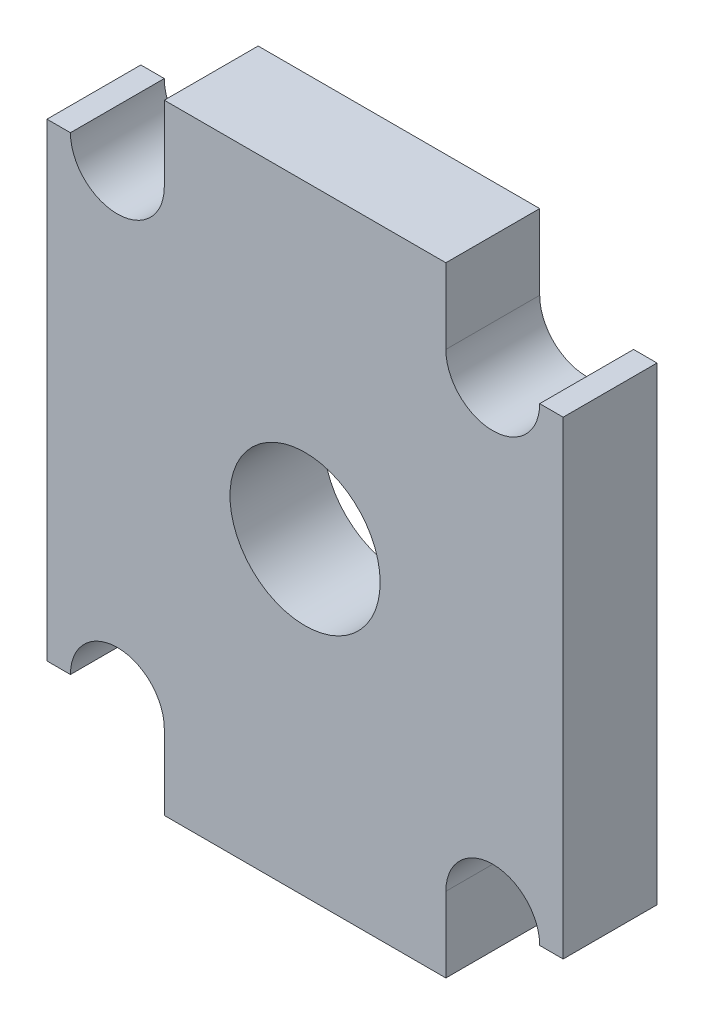
ISO-10303-21;
HEADER;
FILE_DESCRIPTION(('STEP AP214'),'2;1');
FILE_NAME('part.step','',(''),(''),'','','');
FILE_SCHEMA(('AUTOMOTIVE_DESIGN { 1 0 10303 214 1 1 1 1 }'));
ENDSEC;
DATA;
#1=APPLICATION_CONTEXT('core data for automotive mechanical design processes');
#2=APPLICATION_PROTOCOL_DEFINITION('international standard','automotive_design',2000,#1);
#3=PRODUCT_CONTEXT('',#1,'mechanical');
#4=PRODUCT('Part','Part','',(#3));
#5=PRODUCT_RELATED_PRODUCT_CATEGORY('part','',(#4));
#6=PRODUCT_DEFINITION_FORMATION('','',#4);
#7=PRODUCT_DEFINITION_CONTEXT('part definition',#1,'design');
#8=PRODUCT_DEFINITION('design','',#6,#7);
#9=PRODUCT_DEFINITION_SHAPE('','',#8);
#10=(LENGTH_UNIT() NAMED_UNIT(*) SI_UNIT(.MILLI.,.METRE.));
#11=(NAMED_UNIT(*) PLANE_ANGLE_UNIT() SI_UNIT($,.RADIAN.));
#12=(NAMED_UNIT(*) SI_UNIT($,.STERADIAN.) SOLID_ANGLE_UNIT());
#13=UNCERTAINTY_MEASURE_WITH_UNIT(LENGTH_MEASURE(1.E-05),#10,'distance_accuracy_value','');
#14=(GEOMETRIC_REPRESENTATION_CONTEXT(3) GLOBAL_UNCERTAINTY_ASSIGNED_CONTEXT((#13)) GLOBAL_UNIT_ASSIGNED_CONTEXT((#10,
#11,#12)) REPRESENTATION_CONTEXT('',''));
#15=CARTESIAN_POINT('',(0.,0.,0.));
#16=DIRECTION('',(0.,0.,1.));
#17=DIRECTION('',(1.,0.,0.));
#18=AXIS2_PLACEMENT_3D('',#15,#16,#17);
#19=CARTESIAN_POINT('',(114.05,10.,2.));
#20=DIRECTION('',(0.,0.,-1.));
#21=DIRECTION('',(-1.,0.,0.));
#22=AXIS2_PLACEMENT_3D('',#19,#20,#21);
#23=PLANE('',#22);
#24=DIRECTION('',(-1.,0.,0.));
#25=VECTOR('',#24,1.);
#26=CARTESIAN_POINT('',(121.05,11.6,2.));
#27=LINE('',#26,#25);
#28=CARTESIAN_POINT('',(121.05,11.6,2.));
#29=VERTEX_POINT('',#28);
#30=CARTESIAN_POINT('',(115.05,11.6,2.));
#31=VERTEX_POINT('',#30);
#32=EDGE_CURVE('E208',#29,#31,#27,.T.);
#33=ORIENTED_EDGE('',*,*,#32,.T.);
#34=DIRECTION('',(0.,-1.,0.));
#35=VECTOR('',#34,1.);
#36=CARTESIAN_POINT('',(115.05,10.,2.));
#37=LINE('',#36,#35);
#38=CARTESIAN_POINT('',(115.05,10.,2.));
#39=VERTEX_POINT('',#38);
#40=EDGE_CURVE('E116',#31,#39,#37,.T.);
#41=ORIENTED_EDGE('',*,*,#40,.T.);
#42=CARTESIAN_POINT('',(114.05,10.,2.));
#43=DIRECTION('',(0.,0.,-1.));
#44=DIRECTION('',(-1.,0.,0.));
#45=AXIS2_PLACEMENT_3D('',#42,#43,#44);
#46=CIRCLE('',#45,0.999999999999994);
#47=CARTESIAN_POINT('',(113.05,10.,2.));
#48=VERTEX_POINT('',#47);
#49=EDGE_CURVE('E247',#39,#48,#46,.T.);
#50=ORIENTED_EDGE('',*,*,#49,.T.);
#51=DIRECTION('',(-1.,0.,0.));
#52=VECTOR('',#51,1.);
#53=CARTESIAN_POINT('',(112.55,10.,2.));
#54=LINE('',#53,#52);
#55=CARTESIAN_POINT('',(112.55,10.,2.));
#56=VERTEX_POINT('',#55);
#57=EDGE_CURVE('E266',#48,#56,#54,.T.);
#58=ORIENTED_EDGE('',*,*,#57,.T.);
#59=DIRECTION('',(0.,-1.,0.));
#60=VECTOR('',#59,1.);
#61=CARTESIAN_POINT('',(112.55,0.,2.));
#62=LINE('',#61,#60);
#63=CARTESIAN_POINT('',(112.55,0.,2.));
#64=VERTEX_POINT('',#63);
#65=EDGE_CURVE('E263',#56,#64,#62,.T.);
#66=ORIENTED_EDGE('',*,*,#65,.T.);
#67=DIRECTION('',(1.,0.,0.));
#68=VECTOR('',#67,1.);
#69=CARTESIAN_POINT('',(112.55,0.,2.));
#70=LINE('',#69,#68);
#71=CARTESIAN_POINT('',(113.05,0.,2.));
#72=VERTEX_POINT('',#71);
#73=EDGE_CURVE('E265',#64,#72,#70,.T.);
#74=ORIENTED_EDGE('',*,*,#73,.T.);
#75=CARTESIAN_POINT('',(114.05,0.,2.));
#76=DIRECTION('',(0.,0.,-1.));
#77=DIRECTION('',(1.,0.,0.));
#78=AXIS2_PLACEMENT_3D('',#75,#76,#77);
#79=CIRCLE('',#78,0.999999999999994);
#80=CARTESIAN_POINT('',(115.05,0.,2.));
#81=VERTEX_POINT('',#80);
#82=EDGE_CURVE('E268',#72,#81,#79,.T.);
#83=ORIENTED_EDGE('',*,*,#82,.T.);
#84=DIRECTION('',(0.,-1.,0.));
#85=VECTOR('',#84,1.);
#86=CARTESIAN_POINT('',(115.05,-1.6,2.));
#87=LINE('',#86,#85);
#88=CARTESIAN_POINT('',(115.05,-1.6,2.));
#89=VERTEX_POINT('',#88);
#90=EDGE_CURVE('E274',#81,#89,#87,.T.);
#91=ORIENTED_EDGE('',*,*,#90,.T.);
#92=DIRECTION('',(1.,0.,0.));
#93=VECTOR('',#92,1.);
#94=CARTESIAN_POINT('',(115.05,-1.6,2.));
#95=LINE('',#94,#93);
#96=CARTESIAN_POINT('',(121.05,-1.6,2.));
#97=VERTEX_POINT('',#96);
#98=EDGE_CURVE('E276',#89,#97,#95,.T.);
#99=ORIENTED_EDGE('',*,*,#98,.T.);
#100=DIRECTION('',(0.,1.,0.));
#101=VECTOR('',#100,1.);
#102=CARTESIAN_POINT('',(121.05,-1.6,2.));
#103=LINE('',#102,#101);
#104=CARTESIAN_POINT('',(121.05,0.,2.));
#105=VERTEX_POINT('',#104);
#106=EDGE_CURVE('E278',#97,#105,#103,.T.);
#107=ORIENTED_EDGE('',*,*,#106,.T.);
#108=CARTESIAN_POINT('',(122.05,0.,2.));
#109=DIRECTION('',(0.,0.,-1.));
#110=DIRECTION('',(-1.,0.,0.));
#111=AXIS2_PLACEMENT_3D('',#108,#109,#110);
#112=CIRCLE('',#111,0.999999999999994);
#113=CARTESIAN_POINT('',(123.05,0.,2.));
#114=VERTEX_POINT('',#113);
#115=EDGE_CURVE('E280',#105,#114,#112,.T.);
#116=ORIENTED_EDGE('',*,*,#115,.T.);
#117=DIRECTION('',(1.,0.,0.));
#118=VECTOR('',#117,1.);
#119=CARTESIAN_POINT('',(123.55,0.,2.));
#120=LINE('',#119,#118);
#121=CARTESIAN_POINT('',(123.55,0.,2.));
#122=VERTEX_POINT('',#121);
#123=EDGE_CURVE('E282',#114,#122,#120,.T.);
#124=ORIENTED_EDGE('',*,*,#123,.T.);
#125=DIRECTION('',(0.,1.,0.));
#126=VECTOR('',#125,1.);
#127=CARTESIAN_POINT('',(123.55,0.,2.));
#128=LINE('',#127,#126);
#129=CARTESIAN_POINT('',(123.55,10.,2.));
#130=VERTEX_POINT('',#129);
#131=EDGE_CURVE('E159',#122,#130,#128,.T.);
#132=ORIENTED_EDGE('',*,*,#131,.T.);
#133=DIRECTION('',(-1.,0.,0.));
#134=VECTOR('',#133,1.);
#135=CARTESIAN_POINT('',(123.55,10.,2.));
#136=LINE('',#135,#134);
#137=CARTESIAN_POINT('',(123.05,10.,2.));
#138=VERTEX_POINT('',#137);
#139=EDGE_CURVE('E153',#130,#138,#136,.T.);
#140=ORIENTED_EDGE('',*,*,#139,.T.);
#141=CARTESIAN_POINT('',(122.05,10.,2.));
#142=DIRECTION('',(0.,0.,-1.));
#143=DIRECTION('',(1.,0.,0.));
#144=AXIS2_PLACEMENT_3D('',#141,#142,#143);
#145=CIRCLE('',#144,0.999999999999994);
#146=CARTESIAN_POINT('',(121.05,10.,2.));
#147=VERTEX_POINT('',#146);
#148=EDGE_CURVE('E157',#138,#147,#145,.T.);
#149=ORIENTED_EDGE('',*,*,#148,.T.);
#150=DIRECTION('',(0.,1.,0.));
#151=VECTOR('',#150,1.);
#152=CARTESIAN_POINT('',(121.05,10.,2.));
#153=LINE('',#152,#151);
#154=EDGE_CURVE('E49',#147,#29,#153,.T.);
#155=ORIENTED_EDGE('',*,*,#154,.T.);
#156=EDGE_LOOP('',(#33,#41,#50,#58,#66,#74,#83,#91,#99,#107,#116,#124,#132,#140,#149,#155));
#157=FACE_BOUND('',#156,.T.);
#158=CARTESIAN_POINT('',(118.05,5.,2.));
#159=DIRECTION('',(0.,0.,1.));
#160=DIRECTION('',(1.,0.,0.));
#161=AXIS2_PLACEMENT_3D('',#158,#159,#160);
#162=CIRCLE('',#161,1.60000000000001);
#163=CARTESIAN_POINT('',(119.65,5.,2.));
#164=VERTEX_POINT('',#163);
#165=EDGE_CURVE('E181',#164,#164,#162,.T.);
#166=ORIENTED_EDGE('',*,*,#165,.F.);
#167=EDGE_LOOP('',(#166));
#168=FACE_BOUND('',#167,.T.);
#169=ADVANCED_FACE('F32',(#157,#168),#23,.F.);
#170=CARTESIAN_POINT('',(114.05,10.,0.));
#171=DIRECTION('',(0.,0.,-1.));
#172=DIRECTION('',(-1.,0.,0.));
#173=AXIS2_PLACEMENT_3D('',#170,#171,#172);
#174=PLANE('',#173);
#175=DIRECTION('',(-1.,0.,0.));
#176=VECTOR('',#175,1.);
#177=CARTESIAN_POINT('',(121.05,11.6,0.));
#178=LINE('',#177,#176);
#179=CARTESIAN_POINT('',(121.05,11.6,0.));
#180=VERTEX_POINT('',#179);
#181=CARTESIAN_POINT('',(115.05,11.6,0.));
#182=VERTEX_POINT('',#181);
#183=EDGE_CURVE('E177',#180,#182,#178,.T.);
#184=ORIENTED_EDGE('',*,*,#183,.F.);
#185=DIRECTION('',(0.,1.,0.));
#186=VECTOR('',#185,1.);
#187=CARTESIAN_POINT('',(121.05,10.,0.));
#188=LINE('',#187,#186);
#189=CARTESIAN_POINT('',(121.05,10.,0.));
#190=VERTEX_POINT('',#189);
#191=EDGE_CURVE('E108',#190,#180,#188,.T.);
#192=ORIENTED_EDGE('',*,*,#191,.F.);
#193=CARTESIAN_POINT('',(122.05,10.,0.));
#194=DIRECTION('',(0.,0.,-1.));
#195=DIRECTION('',(1.,0.,0.));
#196=AXIS2_PLACEMENT_3D('',#193,#194,#195);
#197=CIRCLE('',#196,0.999999999999994);
#198=CARTESIAN_POINT('',(123.05,10.,0.));
#199=VERTEX_POINT('',#198);
#200=EDGE_CURVE('E102',#199,#190,#197,.T.);
#201=ORIENTED_EDGE('',*,*,#200,.F.);
#202=DIRECTION('',(-1.,0.,0.));
#203=VECTOR('',#202,1.);
#204=CARTESIAN_POINT('',(123.55,10.,0.));
#205=LINE('',#204,#203);
#206=CARTESIAN_POINT('',(123.55,10.,0.));
#207=VERTEX_POINT('',#206);
#208=EDGE_CURVE('E167',#207,#199,#205,.T.);
#209=ORIENTED_EDGE('',*,*,#208,.F.);
#210=DIRECTION('',(0.,1.,0.));
#211=VECTOR('',#210,1.);
#212=CARTESIAN_POINT('',(123.55,0.,0.));
#213=LINE('',#212,#211);
#214=CARTESIAN_POINT('',(123.55,0.,0.));
#215=VERTEX_POINT('',#214);
#216=EDGE_CURVE('E203',#215,#207,#213,.T.);
#217=ORIENTED_EDGE('',*,*,#216,.F.);
#218=DIRECTION('',(1.,0.,0.));
#219=VECTOR('',#218,1.);
#220=CARTESIAN_POINT('',(123.55,0.,0.));
#221=LINE('',#220,#219);
#222=CARTESIAN_POINT('',(123.05,0.,0.));
#223=VERTEX_POINT('',#222);
#224=EDGE_CURVE('E201',#223,#215,#221,.T.);
#225=ORIENTED_EDGE('',*,*,#224,.F.);
#226=CARTESIAN_POINT('',(122.05,0.,0.));
#227=DIRECTION('',(0.,0.,-1.));
#228=DIRECTION('',(-1.,0.,0.));
#229=AXIS2_PLACEMENT_3D('',#226,#227,#228);
#230=CIRCLE('',#229,0.999999999999994);
#231=CARTESIAN_POINT('',(121.05,0.,0.));
#232=VERTEX_POINT('',#231);
#233=EDGE_CURVE('E199',#232,#223,#230,.T.);
#234=ORIENTED_EDGE('',*,*,#233,.F.);
#235=DIRECTION('',(0.,1.,0.));
#236=VECTOR('',#235,1.);
#237=CARTESIAN_POINT('',(121.05,-1.6,0.));
#238=LINE('',#237,#236);
#239=CARTESIAN_POINT('',(121.05,-1.6,0.));
#240=VERTEX_POINT('',#239);
#241=EDGE_CURVE('E197',#240,#232,#238,.T.);
#242=ORIENTED_EDGE('',*,*,#241,.F.);
#243=DIRECTION('',(1.,0.,0.));
#244=VECTOR('',#243,1.);
#245=CARTESIAN_POINT('',(115.05,-1.6,0.));
#246=LINE('',#245,#244);
#247=CARTESIAN_POINT('',(115.05,-1.6,0.));
#248=VERTEX_POINT('',#247);
#249=EDGE_CURVE('E195',#248,#240,#246,.T.);
#250=ORIENTED_EDGE('',*,*,#249,.F.);
#251=DIRECTION('',(0.,-1.,0.));
#252=VECTOR('',#251,1.);
#253=CARTESIAN_POINT('',(115.05,-1.6,0.));
#254=LINE('',#253,#252);
#255=CARTESIAN_POINT('',(115.05,0.,0.));
#256=VERTEX_POINT('',#255);
#257=EDGE_CURVE('E193',#256,#248,#254,.T.);
#258=ORIENTED_EDGE('',*,*,#257,.F.);
#259=CARTESIAN_POINT('',(114.05,0.,0.));
#260=DIRECTION('',(0.,0.,-1.));
#261=DIRECTION('',(1.,0.,0.));
#262=AXIS2_PLACEMENT_3D('',#259,#260,#261);
#263=CIRCLE('',#262,0.999999999999994);
#264=CARTESIAN_POINT('',(113.05,0.,0.));
#265=VERTEX_POINT('',#264);
#266=EDGE_CURVE('E191',#265,#256,#263,.T.);
#267=ORIENTED_EDGE('',*,*,#266,.F.);
#268=DIRECTION('',(1.,0.,0.));
#269=VECTOR('',#268,1.);
#270=CARTESIAN_POINT('',(112.55,0.,0.));
#271=LINE('',#270,#269);
#272=CARTESIAN_POINT('',(112.55,0.,0.));
#273=VERTEX_POINT('',#272);
#274=EDGE_CURVE('E189',#273,#265,#271,.T.);
#275=ORIENTED_EDGE('',*,*,#274,.F.);
#276=DIRECTION('',(0.,-1.,0.));
#277=VECTOR('',#276,1.);
#278=CARTESIAN_POINT('',(112.55,0.,0.));
#279=LINE('',#278,#277);
#280=CARTESIAN_POINT('',(112.55,10.,0.));
#281=VERTEX_POINT('',#280);
#282=EDGE_CURVE('E187',#281,#273,#279,.T.);
#283=ORIENTED_EDGE('',*,*,#282,.F.);
#284=DIRECTION('',(-1.,0.,0.));
#285=VECTOR('',#284,1.);
#286=CARTESIAN_POINT('',(112.55,10.,0.));
#287=LINE('',#286,#285);
#288=CARTESIAN_POINT('',(113.05,10.,0.));
#289=VERTEX_POINT('',#288);
#290=EDGE_CURVE('E185',#289,#281,#287,.T.);
#291=ORIENTED_EDGE('',*,*,#290,.F.);
#292=CARTESIAN_POINT('',(114.05,10.,0.));
#293=DIRECTION('',(0.,0.,-1.));
#294=DIRECTION('',(-1.,0.,0.));
#295=AXIS2_PLACEMENT_3D('',#292,#293,#294);
#296=CIRCLE('',#295,0.999999999999994);
#297=CARTESIAN_POINT('',(115.05,10.,0.));
#298=VERTEX_POINT('',#297);
#299=EDGE_CURVE('E183',#298,#289,#296,.T.);
#300=ORIENTED_EDGE('',*,*,#299,.F.);
#301=DIRECTION('',(0.,-1.,0.));
#302=VECTOR('',#301,1.);
#303=CARTESIAN_POINT('',(115.05,10.,0.));
#304=LINE('',#303,#302);
#305=EDGE_CURVE('E180',#182,#298,#304,.T.);
#306=ORIENTED_EDGE('',*,*,#305,.F.);
#307=EDGE_LOOP('',(#184,#192,#201,#209,#217,#225,#234,#242,#250,#258,#267,#275,#283,#291,#300,#306));
#308=FACE_BOUND('',#307,.T.);
#309=CARTESIAN_POINT('',(118.05,5.,0.));
#310=DIRECTION('',(0.,0.,1.));
#311=DIRECTION('',(1.,0.,0.));
#312=AXIS2_PLACEMENT_3D('',#309,#310,#311);
#313=CIRCLE('',#312,1.60000000000001);
#314=CARTESIAN_POINT('',(119.65,5.,0.));
#315=VERTEX_POINT('',#314);
#316=EDGE_CURVE('E481',#315,#315,#313,.T.);
#317=ORIENTED_EDGE('',*,*,#316,.T.);
#318=EDGE_LOOP('',(#317));
#319=FACE_BOUND('',#318,.T.);
#320=ADVANCED_FACE('F251',(#308,#319),#174,.T.);
#321=CARTESIAN_POINT('',(121.05,11.6,2.));
#322=DIRECTION('',(0.,-1.,0.));
#323=DIRECTION('',(0.,0.,-1.));
#324=AXIS2_PLACEMENT_3D('',#321,#322,#323);
#325=PLANE('',#324);
#326=ORIENTED_EDGE('',*,*,#183,.T.);
#327=DIRECTION('',(0.,0.,-1.));
#328=VECTOR('',#327,1.);
#329=CARTESIAN_POINT('',(115.05,11.6,2.));
#330=LINE('',#329,#328);
#331=EDGE_CURVE('E11',#31,#182,#330,.T.);
#332=ORIENTED_EDGE('',*,*,#331,.F.);
#333=ORIENTED_EDGE('',*,*,#32,.F.);
#334=DIRECTION('',(0.,0.,-1.));
#335=VECTOR('',#334,1.);
#336=CARTESIAN_POINT('',(121.05,11.6,2.));
#337=LINE('',#336,#335);
#338=EDGE_CURVE('E173',#29,#180,#337,.T.);
#339=ORIENTED_EDGE('',*,*,#338,.T.);
#340=EDGE_LOOP('',(#326,#332,#333,#339));
#341=FACE_BOUND('',#340,.T.);
#342=ADVANCED_FACE('F34',(#341),#325,.F.);
#343=CARTESIAN_POINT('',(115.05,10.,2.));
#344=DIRECTION('',(1.,0.,0.));
#345=DIRECTION('',(0.,0.,-1.));
#346=AXIS2_PLACEMENT_3D('',#343,#344,#345);
#347=PLANE('',#346);
#348=ORIENTED_EDGE('',*,*,#305,.T.);
#349=DIRECTION('',(0.,0.,-1.));
#350=VECTOR('',#349,1.);
#351=CARTESIAN_POINT('',(115.05,10.,2.));
#352=LINE('',#351,#350);
#353=EDGE_CURVE('E41',#39,#298,#352,.T.);
#354=ORIENTED_EDGE('',*,*,#353,.F.);
#355=ORIENTED_EDGE('',*,*,#40,.F.);
#356=ORIENTED_EDGE('',*,*,#331,.T.);
#357=EDGE_LOOP('',(#348,#354,#355,#356));
#358=FACE_BOUND('',#357,.T.);
#359=ADVANCED_FACE('F316',(#358),#347,.F.);
#360=CARTESIAN_POINT('',(114.05,10.,2.));
#361=DIRECTION('',(0.,0.,-1.));
#362=DIRECTION('',(-1.,0.,0.));
#363=AXIS2_PLACEMENT_3D('',#360,#361,#362);
#364=CYLINDRICAL_SURFACE('',#363,0.999999999999994);
#365=ORIENTED_EDGE('',*,*,#299,.T.);
#366=DIRECTION('',(0.,0.,-1.));
#367=VECTOR('',#366,1.);
#368=CARTESIAN_POINT('',(113.05,10.,2.));
#369=LINE('',#368,#367);
#370=EDGE_CURVE('E239',#48,#289,#369,.T.);
#371=ORIENTED_EDGE('',*,*,#370,.F.);
#372=ORIENTED_EDGE('',*,*,#49,.F.);
#373=ORIENTED_EDGE('',*,*,#353,.T.);
#374=EDGE_LOOP('',(#365,#371,#372,#373));
#375=FACE_BOUND('',#374,.T.);
#376=ADVANCED_FACE('F245',(#375),#364,.F.);
#377=CARTESIAN_POINT('',(112.55,10.,2.));
#378=DIRECTION('',(0.,-1.,0.));
#379=DIRECTION('',(1.,0.,0.));
#380=AXIS2_PLACEMENT_3D('',#377,#378,#379);
#381=PLANE('',#380);
#382=ORIENTED_EDGE('',*,*,#290,.T.);
#383=DIRECTION('',(0.,0.,-1.));
#384=VECTOR('',#383,1.);
#385=CARTESIAN_POINT('',(112.55,10.,2.));
#386=LINE('',#385,#384);
#387=EDGE_CURVE('E236',#56,#281,#386,.T.);
#388=ORIENTED_EDGE('',*,*,#387,.F.);
#389=ORIENTED_EDGE('',*,*,#57,.F.);
#390=ORIENTED_EDGE('',*,*,#370,.T.);
#391=EDGE_LOOP('',(#382,#388,#389,#390));
#392=FACE_BOUND('',#391,.T.);
#393=ADVANCED_FACE('F257',(#392),#381,.F.);
#394=CARTESIAN_POINT('',(112.55,0.,2.));
#395=DIRECTION('',(1.,0.,0.));
#396=DIRECTION('',(0.,0.,-1.));
#397=AXIS2_PLACEMENT_3D('',#394,#395,#396);
#398=PLANE('',#397);
#399=ORIENTED_EDGE('',*,*,#282,.T.);
#400=DIRECTION('',(0.,0.,-1.));
#401=VECTOR('',#400,1.);
#402=CARTESIAN_POINT('',(112.55,0.,2.));
#403=LINE('',#402,#401);
#404=EDGE_CURVE('E233',#64,#273,#403,.T.);
#405=ORIENTED_EDGE('',*,*,#404,.F.);
#406=ORIENTED_EDGE('',*,*,#65,.F.);
#407=ORIENTED_EDGE('',*,*,#387,.T.);
#408=EDGE_LOOP('',(#399,#405,#406,#407));
#409=FACE_BOUND('',#408,.T.);
#410=ADVANCED_FACE('F261',(#409),#398,.F.);
#411=CARTESIAN_POINT('',(112.55,0.,2.));
#412=DIRECTION('',(0.,1.,0.));
#413=DIRECTION('',(-1.,0.,0.));
#414=AXIS2_PLACEMENT_3D('',#411,#412,#413);
#415=PLANE('',#414);
#416=ORIENTED_EDGE('',*,*,#274,.T.);
#417=DIRECTION('',(0.,0.,-1.));
#418=VECTOR('',#417,1.);
#419=CARTESIAN_POINT('',(113.05,0.,2.));
#420=LINE('',#419,#418);
#421=EDGE_CURVE('E230',#72,#265,#420,.T.);
#422=ORIENTED_EDGE('',*,*,#421,.F.);
#423=ORIENTED_EDGE('',*,*,#73,.F.);
#424=ORIENTED_EDGE('',*,*,#404,.T.);
#425=EDGE_LOOP('',(#416,#422,#423,#424));
#426=FACE_BOUND('',#425,.T.);
#427=ADVANCED_FACE('F329',(#426),#415,.F.);
#428=CARTESIAN_POINT('',(114.05,0.,2.));
#429=DIRECTION('',(0.,0.,-1.));
#430=DIRECTION('',(-1.,0.,0.));
#431=AXIS2_PLACEMENT_3D('',#428,#429,#430);
#432=CYLINDRICAL_SURFACE('',#431,0.999999999999994);
#433=ORIENTED_EDGE('',*,*,#266,.T.);
#434=DIRECTION('',(0.,0.,-1.));
#435=VECTOR('',#434,1.);
#436=CARTESIAN_POINT('',(115.05,0.,2.));
#437=LINE('',#436,#435);
#438=EDGE_CURVE('E227',#81,#256,#437,.T.);
#439=ORIENTED_EDGE('',*,*,#438,.F.);
#440=ORIENTED_EDGE('',*,*,#82,.F.);
#441=ORIENTED_EDGE('',*,*,#421,.T.);
#442=EDGE_LOOP('',(#433,#439,#440,#441));
#443=FACE_BOUND('',#442,.T.);
#444=ADVANCED_FACE('F332',(#443),#432,.F.);
#445=CARTESIAN_POINT('',(115.05,-1.6,2.));
#446=DIRECTION('',(1.,0.,0.));
#447=DIRECTION('',(0.,0.,-1.));
#448=AXIS2_PLACEMENT_3D('',#445,#446,#447);
#449=PLANE('',#448);
#450=ORIENTED_EDGE('',*,*,#257,.T.);
#451=DIRECTION('',(0.,0.,-1.));
#452=VECTOR('',#451,1.);
#453=CARTESIAN_POINT('',(115.05,-1.6,2.));
#454=LINE('',#453,#452);
#455=EDGE_CURVE('E224',#89,#248,#454,.T.);
#456=ORIENTED_EDGE('',*,*,#455,.F.);
#457=ORIENTED_EDGE('',*,*,#90,.F.);
#458=ORIENTED_EDGE('',*,*,#438,.T.);
#459=EDGE_LOOP('',(#450,#456,#457,#458));
#460=FACE_BOUND('',#459,.T.);
#461=ADVANCED_FACE('F336',(#460),#449,.F.);
#462=CARTESIAN_POINT('',(115.05,-1.6,2.));
#463=DIRECTION('',(0.,1.,0.));
#464=DIRECTION('',(-1.,0.,0.));
#465=AXIS2_PLACEMENT_3D('',#462,#463,#464);
#466=PLANE('',#465);
#467=ORIENTED_EDGE('',*,*,#249,.T.);
#468=DIRECTION('',(0.,0.,-1.));
#469=VECTOR('',#468,1.);
#470=CARTESIAN_POINT('',(121.05,-1.6,2.));
#471=LINE('',#470,#469);
#472=EDGE_CURVE('E221',#97,#240,#471,.T.);
#473=ORIENTED_EDGE('',*,*,#472,.F.);
#474=ORIENTED_EDGE('',*,*,#98,.F.);
#475=ORIENTED_EDGE('',*,*,#455,.T.);
#476=EDGE_LOOP('',(#467,#473,#474,#475));
#477=FACE_BOUND('',#476,.T.);
#478=ADVANCED_FACE('F340',(#477),#466,.F.);
#479=CARTESIAN_POINT('',(121.05,-1.6,2.));
#480=DIRECTION('',(-1.,0.,0.));
#481=DIRECTION('',(0.,0.,1.));
#482=AXIS2_PLACEMENT_3D('',#479,#480,#481);
#483=PLANE('',#482);
#484=ORIENTED_EDGE('',*,*,#241,.T.);
#485=DIRECTION('',(0.,0.,-1.));
#486=VECTOR('',#485,1.);
#487=CARTESIAN_POINT('',(121.05,0.,2.));
#488=LINE('',#487,#486);
#489=EDGE_CURVE('E218',#105,#232,#488,.T.);
#490=ORIENTED_EDGE('',*,*,#489,.F.);
#491=ORIENTED_EDGE('',*,*,#106,.F.);
#492=ORIENTED_EDGE('',*,*,#472,.T.);
#493=EDGE_LOOP('',(#484,#490,#491,#492));
#494=FACE_BOUND('',#493,.T.);
#495=ADVANCED_FACE('F344',(#494),#483,.F.);
#496=CARTESIAN_POINT('',(122.05,0.,2.));
#497=DIRECTION('',(0.,0.,-1.));
#498=DIRECTION('',(-1.,0.,0.));
#499=AXIS2_PLACEMENT_3D('',#496,#497,#498);
#500=CYLINDRICAL_SURFACE('',#499,0.999999999999994);
#501=ORIENTED_EDGE('',*,*,#233,.T.);
#502=DIRECTION('',(0.,0.,-1.));
#503=VECTOR('',#502,1.);
#504=CARTESIAN_POINT('',(123.05,0.,2.));
#505=LINE('',#504,#503);
#506=EDGE_CURVE('E215',#114,#223,#505,.T.);
#507=ORIENTED_EDGE('',*,*,#506,.F.);
#508=ORIENTED_EDGE('',*,*,#115,.F.);
#509=ORIENTED_EDGE('',*,*,#489,.T.);
#510=EDGE_LOOP('',(#501,#507,#508,#509));
#511=FACE_BOUND('',#510,.T.);
#512=ADVANCED_FACE('F348',(#511),#500,.F.);
#513=CARTESIAN_POINT('',(123.55,0.,2.));
#514=DIRECTION('',(0.,1.,0.));
#515=DIRECTION('',(-1.,0.,0.));
#516=AXIS2_PLACEMENT_3D('',#513,#514,#515);
#517=PLANE('',#516);
#518=ORIENTED_EDGE('',*,*,#224,.T.);
#519=DIRECTION('',(0.,0.,-1.));
#520=VECTOR('',#519,1.);
#521=CARTESIAN_POINT('',(123.55,0.,2.));
#522=LINE('',#521,#520);
#523=EDGE_CURVE('E212',#122,#215,#522,.T.);
#524=ORIENTED_EDGE('',*,*,#523,.F.);
#525=ORIENTED_EDGE('',*,*,#123,.F.);
#526=ORIENTED_EDGE('',*,*,#506,.T.);
#527=EDGE_LOOP('',(#518,#524,#525,#526));
#528=FACE_BOUND('',#527,.T.);
#529=ADVANCED_FACE('F288',(#528),#517,.F.);
#530=CARTESIAN_POINT('',(123.55,0.,2.));
#531=DIRECTION('',(-1.,0.,0.));
#532=DIRECTION('',(0.,0.,1.));
#533=AXIS2_PLACEMENT_3D('',#530,#531,#532);
#534=PLANE('',#533);
#535=ORIENTED_EDGE('',*,*,#216,.T.);
#536=DIRECTION('',(0.,0.,-1.));
#537=VECTOR('',#536,1.);
#538=CARTESIAN_POINT('',(123.55,10.,2.));
#539=LINE('',#538,#537);
#540=EDGE_CURVE('E168',#130,#207,#539,.T.);
#541=ORIENTED_EDGE('',*,*,#540,.F.);
#542=ORIENTED_EDGE('',*,*,#131,.F.);
#543=ORIENTED_EDGE('',*,*,#523,.T.);
#544=EDGE_LOOP('',(#535,#541,#542,#543));
#545=FACE_BOUND('',#544,.T.);
#546=ADVANCED_FACE('F292',(#545),#534,.F.);
#547=CARTESIAN_POINT('',(123.55,10.,2.));
#548=DIRECTION('',(0.,-1.,0.));
#549=DIRECTION('',(1.,0.,0.));
#550=AXIS2_PLACEMENT_3D('',#547,#548,#549);
#551=PLANE('',#550);
#552=ORIENTED_EDGE('',*,*,#208,.T.);
#553=DIRECTION('',(0.,0.,-1.));
#554=VECTOR('',#553,1.);
#555=CARTESIAN_POINT('',(123.05,10.,2.));
#556=LINE('',#555,#554);
#557=EDGE_CURVE('E164',#138,#199,#556,.T.);
#558=ORIENTED_EDGE('',*,*,#557,.F.);
#559=ORIENTED_EDGE('',*,*,#139,.F.);
#560=ORIENTED_EDGE('',*,*,#540,.T.);
#561=EDGE_LOOP('',(#552,#558,#559,#560));
#562=FACE_BOUND('',#561,.T.);
#563=ADVANCED_FACE('F165',(#562),#551,.F.);
#564=CARTESIAN_POINT('',(122.05,10.,2.));
#565=DIRECTION('',(0.,0.,-1.));
#566=DIRECTION('',(-1.,0.,0.));
#567=AXIS2_PLACEMENT_3D('',#564,#565,#566);
#568=CYLINDRICAL_SURFACE('',#567,0.999999999999994);
#569=ORIENTED_EDGE('',*,*,#200,.T.);
#570=DIRECTION('',(0.,0.,-1.));
#571=VECTOR('',#570,1.);
#572=CARTESIAN_POINT('',(121.05,10.,2.));
#573=LINE('',#572,#571);
#574=EDGE_CURVE('E169',#147,#190,#573,.T.);
#575=ORIENTED_EDGE('',*,*,#574,.F.);
#576=ORIENTED_EDGE('',*,*,#148,.F.);
#577=ORIENTED_EDGE('',*,*,#557,.T.);
#578=EDGE_LOOP('',(#569,#575,#576,#577));
#579=FACE_BOUND('',#578,.T.);
#580=ADVANCED_FACE('F171',(#579),#568,.F.);
#581=CARTESIAN_POINT('',(121.05,10.,2.));
#582=DIRECTION('',(-1.,0.,0.));
#583=DIRECTION('',(0.,0.,1.));
#584=AXIS2_PLACEMENT_3D('',#581,#582,#583);
#585=PLANE('',#584);
#586=ORIENTED_EDGE('',*,*,#191,.T.);
#587=ORIENTED_EDGE('',*,*,#338,.F.);
#588=ORIENTED_EDGE('',*,*,#154,.F.);
#589=ORIENTED_EDGE('',*,*,#574,.T.);
#590=EDGE_LOOP('',(#586,#587,#588,#589));
#591=FACE_BOUND('',#590,.T.);
#592=ADVANCED_FACE('F296',(#591),#585,.F.);
#593=CARTESIAN_POINT('',(118.05,5.,2.));
#594=DIRECTION('',(0.,0.,-1.));
#595=DIRECTION('',(-1.,0.,0.));
#596=AXIS2_PLACEMENT_3D('',#593,#594,#595);
#597=CYLINDRICAL_SURFACE('',#596,1.60000000000001);
#598=ORIENTED_EDGE('',*,*,#165,.T.);
#599=EDGE_LOOP('',(#598));
#600=FACE_BOUND('',#599,.T.);
#601=ORIENTED_EDGE('',*,*,#316,.F.);
#602=EDGE_LOOP('',(#601));
#603=FACE_BOUND('',#602,.T.);
#604=ADVANCED_FACE('F298',(#600,#603),#597,.F.);
#605=CLOSED_SHELL('',(#169,#320,#342,#359,#376,#393,#410,#427,#444,#461,#478,#495,#512,#529,
#546,#563,#580,#592,#604));
#606=MANIFOLD_SOLID_BREP('B2',#605);
#607=ADVANCED_BREP_SHAPE_REPRESENTATION('',(#18,#606),#14);
#608=SHAPE_DEFINITION_REPRESENTATION(#9,#607);
ENDSEC;
END-ISO-10303-21;
